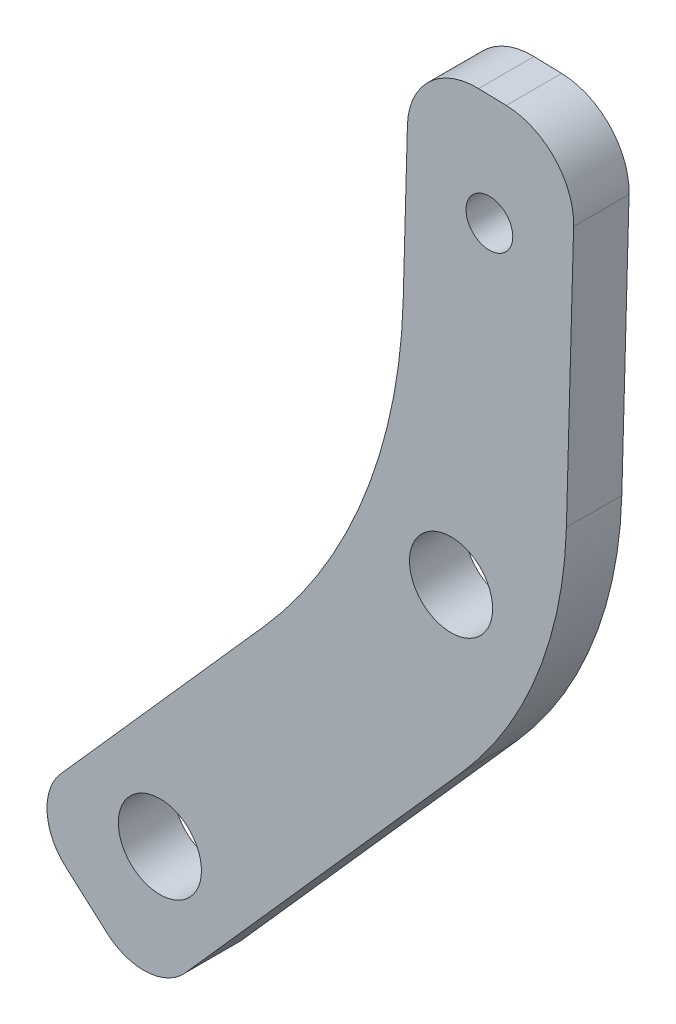
ISO-10303-21;
HEADER;
FILE_DESCRIPTION(('STEP AP214'),'2;1');
FILE_NAME('part.step','',(''),(''),'','','');
FILE_SCHEMA(('AUTOMOTIVE_DESIGN { 1 0 10303 214 1 1 1 1 }'));
ENDSEC;
DATA;
#1=APPLICATION_CONTEXT('core data for automotive mechanical design processes');
#2=APPLICATION_PROTOCOL_DEFINITION('international standard','automotive_design',2000,#1);
#3=PRODUCT_CONTEXT('',#1,'mechanical');
#4=PRODUCT('Part','Part','',(#3));
#5=PRODUCT_RELATED_PRODUCT_CATEGORY('part','',(#4));
#6=PRODUCT_DEFINITION_FORMATION('','',#4);
#7=PRODUCT_DEFINITION_CONTEXT('part definition',#1,'design');
#8=PRODUCT_DEFINITION('design','',#6,#7);
#9=PRODUCT_DEFINITION_SHAPE('','',#8);
#10=(LENGTH_UNIT() NAMED_UNIT(*) SI_UNIT(.MILLI.,.METRE.));
#11=(NAMED_UNIT(*) PLANE_ANGLE_UNIT() SI_UNIT($,.RADIAN.));
#12=(NAMED_UNIT(*) SI_UNIT($,.STERADIAN.) SOLID_ANGLE_UNIT());
#13=UNCERTAINTY_MEASURE_WITH_UNIT(LENGTH_MEASURE(1.E-05),#10,'distance_accuracy_value','');
#14=(GEOMETRIC_REPRESENTATION_CONTEXT(3) GLOBAL_UNCERTAINTY_ASSIGNED_CONTEXT((#13)) GLOBAL_UNIT_ASSIGNED_CONTEXT((#10,
#11,#12)) REPRESENTATION_CONTEXT('',''));
#15=CARTESIAN_POINT('',(0.,0.,0.));
#16=DIRECTION('',(0.,0.,1.));
#17=DIRECTION('',(1.,0.,0.));
#18=AXIS2_PLACEMENT_3D('',#15,#16,#17);
#19=CARTESIAN_POINT('',(0.,0.,4.));
#20=DIRECTION('',(0.,0.,1.));
#21=DIRECTION('',(1.,0.,0.));
#22=AXIS2_PLACEMENT_3D('',#19,#20,#21);
#23=PLANE('',#22);
#24=CARTESIAN_POINT('',(-0.123058618540551,6.90403287299958,4.));
#25=DIRECTION('',(0.,0.,1.));
#26=DIRECTION('',(1.,0.,0.));
#27=AXIS2_PLACEMENT_3D('',#24,#25,#26);
#28=CIRCLE('',#27,3.);
#29=CARTESIAN_POINT('',(2.87694138145945,6.90403287299958,4.));
#30=VERTEX_POINT('',#29);
#31=EDGE_CURVE('E416',#30,#30,#28,.T.);
#32=ORIENTED_EDGE('',*,*,#31,.F.);
#33=EDGE_LOOP('',(#32));
#34=FACE_BOUND('',#33,.T.);
#35=CARTESIAN_POINT('',(-21.1352453670654,-19.96983051424,4.));
#36=DIRECTION('',(0.,0.,1.));
#37=DIRECTION('',(1.,0.,0.));
#38=AXIS2_PLACEMENT_3D('',#35,#36,#37);
#39=CIRCLE('',#38,3.);
#40=CARTESIAN_POINT('',(-18.1352453670654,-19.96983051424,4.));
#41=VERTEX_POINT('',#40);
#42=EDGE_CURVE('E154',#41,#41,#39,.T.);
#43=ORIENTED_EDGE('',*,*,#42,.F.);
#44=EDGE_LOOP('',(#43));
#45=FACE_BOUND('',#44,.T.);
#46=DIRECTION('',(0.0273746411645566,0.999625244289635,0.));
#47=VECTOR('',#46,1.);
#48=CARTESIAN_POINT('',(7.9038481184229,3.73103549401107,4.));
#49=LINE('',#48,#47);
#50=CARTESIAN_POINT('',(8.20275475515141,14.6460505242862,4.));
#51=VERTEX_POINT('',#50);
#52=CARTESIAN_POINT('',(8.7250873533596,33.7197928227001,4.));
#53=VERTEX_POINT('',#52);
#54=EDGE_CURVE('E219',#51,#53,#49,.T.);
#55=ORIENTED_EDGE('',*,*,#54,.T.);
#56=CARTESIAN_POINT('',(3.72696113191143,33.8566660285229,4.));
#57=DIRECTION('',(0.,0.,1.));
#58=DIRECTION('',(1.,0.,0.));
#59=AXIS2_PLACEMENT_3D('',#56,#57,#58);
#60=CIRCLE('',#59,5.);
#61=CARTESIAN_POINT('',(3.86383433773419,38.854792249971,4.));
#62=VERTEX_POINT('',#61);
#63=EDGE_CURVE('E42',#53,#62,#60,.T.);
#64=ORIENTED_EDGE('',*,*,#63,.T.);
#65=DIRECTION('',(-0.999625244289635,0.0273746411645533,0.));
#66=VECTOR('',#65,1.);
#67=CARTESIAN_POINT('',(8.86196055918238,38.7179190441483,4.));
#68=LINE('',#67,#66);
#69=CARTESIAN_POINT('',(1.86458384915495,38.9095415323002,4.));
#70=VERTEX_POINT('',#69);
#71=EDGE_CURVE('E218',#62,#70,#68,.T.);
#72=ORIENTED_EDGE('',*,*,#71,.T.);
#73=CARTESIAN_POINT('',(1.72771064333218,33.911415310852,4.));
#74=DIRECTION('',(0.,0.,1.));
#75=DIRECTION('',(1.,0.,0.));
#76=AXIS2_PLACEMENT_3D('',#73,#74,#75);
#77=CIRCLE('',#76,5.);
#78=CARTESIAN_POINT('',(-3.270415578116,34.0482885166748,4.));
#79=VERTEX_POINT('',#78);
#80=EDGE_CURVE('E49',#70,#79,#77,.T.);
#81=ORIENTED_EDGE('',*,*,#80,.T.);
#82=DIRECTION('',(-0.0273746411645527,-0.999625244289635,0.));
#83=VECTOR('',#82,1.);
#84=CARTESIAN_POINT('',(-3.13354237229323,39.0464147381229,4.));
#85=LINE('',#84,#83);
#86=CARTESIAN_POINT('',(-3.57354997605657,22.9788905737962,4.));
#87=VERTEX_POINT('',#86);
#88=EDGE_CURVE('E225',#79,#87,#85,.T.);
#89=ORIENTED_EDGE('',*,*,#88,.T.);
#90=CARTESIAN_POINT('',(-43.558559747642,24.0738762203783,4.));
#91=DIRECTION('',(0.,0.,1.));
#92=DIRECTION('',(1.,0.,0.));
#93=AXIS2_PLACEMENT_3D('',#90,#91,#92);
#94=CIRCLE('',#93,40.);
#95=CARTESIAN_POINT('',(-13.6321084104685,-2.46680030385116,4.));
#96=VERTEX_POINT('',#95);
#97=EDGE_CURVE('E202',#87,#96,#94,.F.);
#98=ORIENTED_EDGE('',*,*,#97,.T.);
#99=DIRECTION('',(-0.663516913105737,-0.748161283429337,0.));
#100=VECTOR('',#99,1.);
#101=CARTESIAN_POINT('',(-3.97209215836119,8.42553720009595,4.));
#102=LINE('',#101,#100);
#103=CARTESIAN_POINT('',(-28.2782807200644,-18.9813741693229,4.));
#104=VERTEX_POINT('',#103);
#105=EDGE_CURVE('E163',#96,#104,#102,.T.);
#106=ORIENTED_EDGE('',*,*,#105,.T.);
#107=CARTESIAN_POINT('',(-25.285635586347,-21.6354418217459,4.));
#108=DIRECTION('',(0.,0.,1.));
#109=DIRECTION('',(1.,0.,0.));
#110=AXIS2_PLACEMENT_3D('',#107,#108,#109);
#111=CIRCLE('',#110,4.);
#112=CARTESIAN_POINT('',(-27.93970323877,-24.6280869554632,4.));
#113=VERTEX_POINT('',#112);
#114=EDGE_CURVE('E179',#104,#113,#111,.T.);
#115=ORIENTED_EDGE('',*,*,#114,.T.);
#116=DIRECTION('',(0.748161283429337,-0.663516913105738,0.));
#117=VECTOR('',#116,1.);
#118=CARTESIAN_POINT('',(-21.9544129713353,-29.9362222603091,4.));
#119=LINE('',#118,#117);
#120=CARTESIAN_POINT('',(-24.9470581050526,-27.2821546078862,4.));
#121=VERTEX_POINT('',#120);
#122=EDGE_CURVE('E146',#113,#121,#119,.T.);
#123=ORIENTED_EDGE('',*,*,#122,.T.);
#124=CARTESIAN_POINT('',(-22.2929904526297,-24.2895094741688,4.));
#125=DIRECTION('',(0.,0.,1.));
#126=DIRECTION('',(1.,0.,0.));
#127=AXIS2_PLACEMENT_3D('',#124,#125,#126);
#128=CIRCLE('',#127,4.);
#129=CARTESIAN_POINT('',(-19.3003453189123,-26.9435771265918,4.));
#130=VERTEX_POINT('',#129);
#131=EDGE_CURVE('E177',#121,#130,#128,.T.);
#132=ORIENTED_EDGE('',*,*,#131,.T.);
#133=DIRECTION('',(0.663516913105737,0.748161283429337,0.));
#134=VECTOR('',#133,1.);
#135=CARTESIAN_POINT('',(7.9038481184229,3.73103549401107,4.));
#136=LINE('',#135,#134);
#137=CARTESIAN_POINT('',(0.658835929342489,-4.43821763394921,4.));
#138=VERTEX_POINT('',#137);
#139=EDGE_CURVE('E240',#130,#138,#136,.T.);
#140=ORIENTED_EDGE('',*,*,#139,.T.);
#141=CARTESIAN_POINT('',(-21.7860025735376,15.4672897592229,4.));
#142=DIRECTION('',(0.,0.,1.));
#143=DIRECTION('',(1.,0.,0.));
#144=AXIS2_PLACEMENT_3D('',#141,#142,#143);
#145=CIRCLE('',#144,30.);
#146=EDGE_CURVE('E191',#138,#51,#145,.T.);
#147=ORIENTED_EDGE('',*,*,#146,.T.);
#148=EDGE_LOOP('',(#55,#64,#72,#81,#89,#98,#106,#115,#123,#132,#140,#147));
#149=FACE_BOUND('',#148,.T.);
#150=CARTESIAN_POINT('',(2.64521196412816,30.8851649368185,4.));
#151=DIRECTION('',(0.,0.,1.));
#152=DIRECTION('',(1.,0.,0.));
#153=AXIS2_PLACEMENT_3D('',#150,#151,#152);
#154=CIRCLE('',#153,1.68830796501838);
#155=CARTESIAN_POINT('',(4.33351992914653,30.8851649368185,4.));
#156=VERTEX_POINT('',#155);
#157=EDGE_CURVE('E408',#156,#156,#154,.T.);
#158=ORIENTED_EDGE('',*,*,#157,.F.);
#159=EDGE_LOOP('',(#158));
#160=FACE_BOUND('',#159,.T.);
#161=ADVANCED_FACE('F33',(#34,#45,#149,#160),#23,.T.);
#162=CARTESIAN_POINT('',(0.,0.,0.));
#163=DIRECTION('',(0.,0.,1.));
#164=DIRECTION('',(1.,0.,0.));
#165=AXIS2_PLACEMENT_3D('',#162,#163,#164);
#166=PLANE('',#165);
#167=CARTESIAN_POINT('',(-0.123058618540551,6.90403287299958,0.));
#168=DIRECTION('',(0.,0.,1.));
#169=DIRECTION('',(1.,0.,0.));
#170=AXIS2_PLACEMENT_3D('',#167,#168,#169);
#171=CIRCLE('',#170,3.);
#172=CARTESIAN_POINT('',(2.87694138145945,6.90403287299958,0.));
#173=VERTEX_POINT('',#172);
#174=EDGE_CURVE('E37',#173,#173,#171,.T.);
#175=ORIENTED_EDGE('',*,*,#174,.T.);
#176=EDGE_LOOP('',(#175));
#177=FACE_BOUND('',#176,.T.);
#178=DIRECTION('',(-0.999625244289635,0.0273746411645533,0.));
#179=VECTOR('',#178,1.);
#180=CARTESIAN_POINT('',(8.86196055918238,38.7179190441483,0.));
#181=LINE('',#180,#179);
#182=CARTESIAN_POINT('',(3.86383433773419,38.854792249971,0.));
#183=VERTEX_POINT('',#182);
#184=CARTESIAN_POINT('',(1.86458384915495,38.9095415323002,0.));
#185=VERTEX_POINT('',#184);
#186=EDGE_CURVE('E167',#183,#185,#181,.T.);
#187=ORIENTED_EDGE('',*,*,#186,.F.);
#188=CARTESIAN_POINT('',(3.72696113191143,33.8566660285229,0.));
#189=DIRECTION('',(0.,0.,1.));
#190=DIRECTION('',(1.,0.,0.));
#191=AXIS2_PLACEMENT_3D('',#188,#189,#190);
#192=CIRCLE('',#191,5.);
#193=CARTESIAN_POINT('',(8.7250873533596,33.7197928227001,0.));
#194=VERTEX_POINT('',#193);
#195=EDGE_CURVE('E211',#183,#194,#192,.F.);
#196=ORIENTED_EDGE('',*,*,#195,.T.);
#197=DIRECTION('',(0.0273746411645566,0.999625244289635,0.));
#198=VECTOR('',#197,1.);
#199=CARTESIAN_POINT('',(7.9038481184229,3.73103549401107,0.));
#200=LINE('',#199,#198);
#201=CARTESIAN_POINT('',(8.20275475515141,14.6460505242862,0.));
#202=VERTEX_POINT('',#201);
#203=EDGE_CURVE('E157',#202,#194,#200,.T.);
#204=ORIENTED_EDGE('',*,*,#203,.F.);
#205=CARTESIAN_POINT('',(-21.7860025735376,15.4672897592229,0.));
#206=DIRECTION('',(0.,0.,1.));
#207=DIRECTION('',(1.,0.,0.));
#208=AXIS2_PLACEMENT_3D('',#205,#206,#207);
#209=CIRCLE('',#208,30.);
#210=CARTESIAN_POINT('',(0.658835929342489,-4.43821763394921,0.));
#211=VERTEX_POINT('',#210);
#212=EDGE_CURVE('E187',#202,#211,#209,.F.);
#213=ORIENTED_EDGE('',*,*,#212,.T.);
#214=DIRECTION('',(0.663516913105737,0.748161283429337,0.));
#215=VECTOR('',#214,1.);
#216=CARTESIAN_POINT('',(7.9038481184229,3.73103549401107,0.));
#217=LINE('',#216,#215);
#218=CARTESIAN_POINT('',(-19.3003453189123,-26.9435771265918,0.));
#219=VERTEX_POINT('',#218);
#220=EDGE_CURVE('E153',#219,#211,#217,.T.);
#221=ORIENTED_EDGE('',*,*,#220,.F.);
#222=CARTESIAN_POINT('',(-22.2929904526297,-24.2895094741688,0.));
#223=DIRECTION('',(0.,0.,1.));
#224=DIRECTION('',(1.,0.,0.));
#225=AXIS2_PLACEMENT_3D('',#222,#223,#224);
#226=CIRCLE('',#225,4.);
#227=CARTESIAN_POINT('',(-24.9470581050526,-27.2821546078862,0.));
#228=VERTEX_POINT('',#227);
#229=EDGE_CURVE('E137',#219,#228,#226,.F.);
#230=ORIENTED_EDGE('',*,*,#229,.T.);
#231=DIRECTION('',(0.748161283429337,-0.663516913105738,0.));
#232=VECTOR('',#231,1.);
#233=CARTESIAN_POINT('',(-21.9544129713353,-29.9362222603091,0.));
#234=LINE('',#233,#232);
#235=CARTESIAN_POINT('',(-27.93970323877,-24.6280869554632,0.));
#236=VERTEX_POINT('',#235);
#237=EDGE_CURVE('E143',#236,#228,#234,.T.);
#238=ORIENTED_EDGE('',*,*,#237,.F.);
#239=CARTESIAN_POINT('',(-25.285635586347,-21.6354418217459,0.));
#240=DIRECTION('',(0.,0.,1.));
#241=DIRECTION('',(1.,0.,0.));
#242=AXIS2_PLACEMENT_3D('',#239,#240,#241);
#243=CIRCLE('',#242,4.);
#244=CARTESIAN_POINT('',(-28.2782807200644,-18.9813741693229,0.));
#245=VERTEX_POINT('',#244);
#246=EDGE_CURVE('E127',#236,#245,#243,.F.);
#247=ORIENTED_EDGE('',*,*,#246,.T.);
#248=DIRECTION('',(-0.663516913105737,-0.748161283429337,0.));
#249=VECTOR('',#248,1.);
#250=CARTESIAN_POINT('',(-3.97209215836119,8.42553720009595,0.));
#251=LINE('',#250,#249);
#252=CARTESIAN_POINT('',(-13.6321084104685,-2.46680030385116,0.));
#253=VERTEX_POINT('',#252);
#254=EDGE_CURVE('E172',#253,#245,#251,.T.);
#255=ORIENTED_EDGE('',*,*,#254,.F.);
#256=CARTESIAN_POINT('',(-43.558559747642,24.0738762203783,0.));
#257=DIRECTION('',(0.,0.,1.));
#258=DIRECTION('',(1.,0.,0.));
#259=AXIS2_PLACEMENT_3D('',#256,#257,#258);
#260=CIRCLE('',#259,40.);
#261=CARTESIAN_POINT('',(-3.57354997605657,22.9788905737962,0.));
#262=VERTEX_POINT('',#261);
#263=EDGE_CURVE('E199',#253,#262,#260,.T.);
#264=ORIENTED_EDGE('',*,*,#263,.T.);
#265=DIRECTION('',(-0.0273746411645527,-0.999625244289635,0.));
#266=VECTOR('',#265,1.);
#267=CARTESIAN_POINT('',(-3.13354237229323,39.0464147381229,0.));
#268=LINE('',#267,#266);
#269=CARTESIAN_POINT('',(-3.270415578116,34.0482885166748,0.));
#270=VERTEX_POINT('',#269);
#271=EDGE_CURVE('E170',#270,#262,#268,.T.);
#272=ORIENTED_EDGE('',*,*,#271,.F.);
#273=CARTESIAN_POINT('',(1.72771064333218,33.911415310852,0.));
#274=DIRECTION('',(0.,0.,1.));
#275=DIRECTION('',(1.,0.,0.));
#276=AXIS2_PLACEMENT_3D('',#273,#274,#275);
#277=CIRCLE('',#276,5.);
#278=EDGE_CURVE('E209',#270,#185,#277,.F.);
#279=ORIENTED_EDGE('',*,*,#278,.T.);
#280=EDGE_LOOP('',(#187,#196,#204,#213,#221,#230,#238,#247,#255,#264,#272,#279));
#281=FACE_BOUND('',#280,.T.);
#282=CARTESIAN_POINT('',(-21.1352453670654,-19.96983051424,0.));
#283=DIRECTION('',(0.,0.,1.));
#284=DIRECTION('',(1.,0.,0.));
#285=AXIS2_PLACEMENT_3D('',#282,#283,#284);
#286=CIRCLE('',#285,3.);
#287=CARTESIAN_POINT('',(-18.1352453670654,-19.96983051424,0.));
#288=VERTEX_POINT('',#287);
#289=EDGE_CURVE('E160',#288,#288,#286,.T.);
#290=ORIENTED_EDGE('',*,*,#289,.T.);
#291=EDGE_LOOP('',(#290));
#292=FACE_BOUND('',#291,.T.);
#293=CARTESIAN_POINT('',(2.64521196412816,30.8851649368185,0.));
#294=DIRECTION('',(0.,0.,1.));
#295=DIRECTION('',(1.,0.,0.));
#296=AXIS2_PLACEMENT_3D('',#293,#294,#295);
#297=CIRCLE('',#296,1.68830796501838);
#298=CARTESIAN_POINT('',(4.33351992914653,30.8851649368185,0.));
#299=VERTEX_POINT('',#298);
#300=EDGE_CURVE('E411',#299,#299,#297,.T.);
#301=ORIENTED_EDGE('',*,*,#300,.T.);
#302=EDGE_LOOP('',(#301));
#303=FACE_BOUND('',#302,.T.);
#304=ADVANCED_FACE('F150',(#177,#281,#292,#303),#166,.F.);
#305=CARTESIAN_POINT('',(-21.9544129713353,-29.9362222603091,4.));
#306=DIRECTION('',(0.663516913105738,0.748161283429337,0.));
#307=DIRECTION('',(-0.748161283429337,0.663516913105738,0.));
#308=AXIS2_PLACEMENT_3D('',#305,#306,#307);
#309=PLANE('',#308);
#310=ORIENTED_EDGE('',*,*,#122,.F.);
#311=DIRECTION('',(0.,0.,-1.));
#312=VECTOR('',#311,1.);
#313=CARTESIAN_POINT('',(-27.93970323877,-24.6280869554632,4.));
#314=LINE('',#313,#312);
#315=EDGE_CURVE('E131',#113,#236,#314,.T.);
#316=ORIENTED_EDGE('',*,*,#315,.T.);
#317=ORIENTED_EDGE('',*,*,#237,.T.);
#318=DIRECTION('',(0.,0.,-1.));
#319=VECTOR('',#318,1.);
#320=CARTESIAN_POINT('',(-24.9470581050526,-27.2821546078862,4.));
#321=LINE('',#320,#319);
#322=EDGE_CURVE('E147',#228,#121,#321,.F.);
#323=ORIENTED_EDGE('',*,*,#322,.T.);
#324=EDGE_LOOP('',(#310,#316,#317,#323));
#325=FACE_BOUND('',#324,.T.);
#326=ADVANCED_FACE('F142',(#325),#309,.F.);
#327=CARTESIAN_POINT('',(7.9038481184229,3.73103549401107,4.));
#328=DIRECTION('',(-0.748161283429337,0.663516913105738,0.));
#329=DIRECTION('',(-0.663516913105738,-0.748161283429337,0.));
#330=AXIS2_PLACEMENT_3D('',#327,#328,#329);
#331=PLANE('',#330);
#332=ORIENTED_EDGE('',*,*,#220,.T.);
#333=DIRECTION('',(0.,0.,-1.));
#334=VECTOR('',#333,1.);
#335=CARTESIAN_POINT('',(0.658835929342488,-4.43821763394921,4.));
#336=LINE('',#335,#334);
#337=EDGE_CURVE('E189',#211,#138,#336,.F.);
#338=ORIENTED_EDGE('',*,*,#337,.T.);
#339=ORIENTED_EDGE('',*,*,#139,.F.);
#340=DIRECTION('',(0.,0.,-1.));
#341=VECTOR('',#340,1.);
#342=CARTESIAN_POINT('',(-19.3003453189123,-26.9435771265918,4.));
#343=LINE('',#342,#341);
#344=EDGE_CURVE('E181',#130,#219,#343,.T.);
#345=ORIENTED_EDGE('',*,*,#344,.T.);
#346=EDGE_LOOP('',(#332,#338,#339,#345));
#347=FACE_BOUND('',#346,.T.);
#348=ADVANCED_FACE('F236',(#347),#331,.F.);
#349=CARTESIAN_POINT('',(7.9038481184229,3.73103549401107,4.));
#350=DIRECTION('',(-0.999625244289635,0.0273746411645566,0.));
#351=DIRECTION('',(-0.0273746411645566,-0.999625244289635,0.));
#352=AXIS2_PLACEMENT_3D('',#349,#350,#351);
#353=PLANE('',#352);
#354=ORIENTED_EDGE('',*,*,#203,.T.);
#355=DIRECTION('',(0.,0.,-1.));
#356=VECTOR('',#355,1.);
#357=CARTESIAN_POINT('',(8.7250873533596,33.7197928227001,4.));
#358=LINE('',#357,#356);
#359=EDGE_CURVE('E57',#194,#53,#358,.F.);
#360=ORIENTED_EDGE('',*,*,#359,.T.);
#361=ORIENTED_EDGE('',*,*,#54,.F.);
#362=DIRECTION('',(0.,0.,-1.));
#363=VECTOR('',#362,1.);
#364=CARTESIAN_POINT('',(8.20275475515141,14.6460505242862,4.));
#365=LINE('',#364,#363);
#366=EDGE_CURVE('E184',#51,#202,#365,.T.);
#367=ORIENTED_EDGE('',*,*,#366,.T.);
#368=EDGE_LOOP('',(#354,#360,#361,#367));
#369=FACE_BOUND('',#368,.T.);
#370=ADVANCED_FACE('F229',(#369),#353,.F.);
#371=CARTESIAN_POINT('',(8.86196055918238,38.7179190441483,4.));
#372=DIRECTION('',(-0.0273746411645533,-0.999625244289635,0.));
#373=DIRECTION('',(0.999625244289635,-0.0273746411645533,0.));
#374=AXIS2_PLACEMENT_3D('',#371,#372,#373);
#375=PLANE('',#374);
#376=ORIENTED_EDGE('',*,*,#71,.F.);
#377=DIRECTION('',(0.,0.,-1.));
#378=VECTOR('',#377,1.);
#379=CARTESIAN_POINT('',(3.86383433773419,38.854792249971,4.));
#380=LINE('',#379,#378);
#381=EDGE_CURVE('E206',#62,#183,#380,.T.);
#382=ORIENTED_EDGE('',*,*,#381,.T.);
#383=ORIENTED_EDGE('',*,*,#186,.T.);
#384=DIRECTION('',(0.,0.,-1.));
#385=VECTOR('',#384,1.);
#386=CARTESIAN_POINT('',(1.86458384915495,38.9095415323002,4.));
#387=LINE('',#386,#385);
#388=EDGE_CURVE('E204',#185,#70,#387,.F.);
#389=ORIENTED_EDGE('',*,*,#388,.T.);
#390=EDGE_LOOP('',(#376,#382,#383,#389));
#391=FACE_BOUND('',#390,.T.);
#392=ADVANCED_FACE('F223',(#391),#375,.F.);
#393=CARTESIAN_POINT('',(-3.13354237229323,39.0464147381229,4.));
#394=DIRECTION('',(0.999625244289635,-0.0273746411645527,0.));
#395=DIRECTION('',(0.0273746411645527,0.999625244289635,0.));
#396=AXIS2_PLACEMENT_3D('',#393,#394,#395);
#397=PLANE('',#396);
#398=ORIENTED_EDGE('',*,*,#88,.F.);
#399=DIRECTION('',(0.,0.,-1.));
#400=VECTOR('',#399,1.);
#401=CARTESIAN_POINT('',(-3.270415578116,34.0482885166748,4.));
#402=LINE('',#401,#400);
#403=EDGE_CURVE('E11',#79,#270,#402,.T.);
#404=ORIENTED_EDGE('',*,*,#403,.T.);
#405=ORIENTED_EDGE('',*,*,#271,.T.);
#406=DIRECTION('',(0.,0.,-1.));
#407=VECTOR('',#406,1.);
#408=CARTESIAN_POINT('',(-3.57354997605657,22.9788905737962,4.));
#409=LINE('',#408,#407);
#410=EDGE_CURVE('E196',#262,#87,#409,.F.);
#411=ORIENTED_EDGE('',*,*,#410,.T.);
#412=EDGE_LOOP('',(#398,#404,#405,#411));
#413=FACE_BOUND('',#412,.T.);
#414=ADVANCED_FACE('F258',(#413),#397,.F.);
#415=CARTESIAN_POINT('',(-3.97209215836119,8.42553720009595,4.));
#416=DIRECTION('',(0.748161283429337,-0.663516913105737,0.));
#417=DIRECTION('',(0.663516913105737,0.748161283429337,0.));
#418=AXIS2_PLACEMENT_3D('',#415,#416,#417);
#419=PLANE('',#418);
#420=ORIENTED_EDGE('',*,*,#105,.F.);
#421=DIRECTION('',(0.,0.,-1.));
#422=VECTOR('',#421,1.);
#423=CARTESIAN_POINT('',(-13.6321084104685,-2.46680030385116,0.));
#424=LINE('',#423,#422);
#425=EDGE_CURVE('E193',#96,#253,#424,.T.);
#426=ORIENTED_EDGE('',*,*,#425,.T.);
#427=ORIENTED_EDGE('',*,*,#254,.T.);
#428=DIRECTION('',(0.,0.,-1.));
#429=VECTOR('',#428,1.);
#430=CARTESIAN_POINT('',(-28.2782807200644,-18.9813741693229,4.));
#431=LINE('',#430,#429);
#432=EDGE_CURVE('E133',#245,#104,#431,.F.);
#433=ORIENTED_EDGE('',*,*,#432,.T.);
#434=EDGE_LOOP('',(#420,#426,#427,#433));
#435=FACE_BOUND('',#434,.T.);
#436=ADVANCED_FACE('F252',(#435),#419,.F.);
#437=CARTESIAN_POINT('',(-21.1352453670654,-19.96983051424,4.));
#438=DIRECTION('',(0.,0.,-1.));
#439=DIRECTION('',(-1.,0.,0.));
#440=AXIS2_PLACEMENT_3D('',#437,#438,#439);
#441=CYLINDRICAL_SURFACE('',#440,3.);
#442=ORIENTED_EDGE('',*,*,#42,.T.);
#443=EDGE_LOOP('',(#442));
#444=FACE_BOUND('',#443,.T.);
#445=ORIENTED_EDGE('',*,*,#289,.F.);
#446=EDGE_LOOP('',(#445));
#447=FACE_BOUND('',#446,.T.);
#448=ADVANCED_FACE('F280',(#444,#447),#441,.F.);
#449=CARTESIAN_POINT('',(2.64521196412816,30.8851649368185,4.));
#450=DIRECTION('',(0.,0.,-1.));
#451=DIRECTION('',(-1.,0.,0.));
#452=AXIS2_PLACEMENT_3D('',#449,#450,#451);
#453=CYLINDRICAL_SURFACE('',#452,1.68830796501838);
#454=ORIENTED_EDGE('',*,*,#157,.T.);
#455=EDGE_LOOP('',(#454));
#456=FACE_BOUND('',#455,.T.);
#457=ORIENTED_EDGE('',*,*,#300,.F.);
#458=EDGE_LOOP('',(#457));
#459=FACE_BOUND('',#458,.T.);
#460=ADVANCED_FACE('F297',(#456,#459),#453,.F.);
#461=CARTESIAN_POINT('',(-25.285635586347,-21.6354418217459,4.));
#462=DIRECTION('',(0.,0.,-1.));
#463=DIRECTION('',(-1.,0.,0.));
#464=AXIS2_PLACEMENT_3D('',#461,#462,#463);
#465=CYLINDRICAL_SURFACE('',#464,4.);
#466=ORIENTED_EDGE('',*,*,#114,.F.);
#467=ORIENTED_EDGE('',*,*,#432,.F.);
#468=ORIENTED_EDGE('',*,*,#246,.F.);
#469=ORIENTED_EDGE('',*,*,#315,.F.);
#470=EDGE_LOOP('',(#466,#467,#468,#469));
#471=FACE_BOUND('',#470,.T.);
#472=ADVANCED_FACE('F130',(#471),#465,.T.);
#473=CARTESIAN_POINT('',(-22.2929904526297,-24.2895094741688,4.));
#474=DIRECTION('',(0.,0.,-1.));
#475=DIRECTION('',(-1.,0.,0.));
#476=AXIS2_PLACEMENT_3D('',#473,#474,#475);
#477=CYLINDRICAL_SURFACE('',#476,4.);
#478=ORIENTED_EDGE('',*,*,#131,.F.);
#479=ORIENTED_EDGE('',*,*,#322,.F.);
#480=ORIENTED_EDGE('',*,*,#229,.F.);
#481=ORIENTED_EDGE('',*,*,#344,.F.);
#482=EDGE_LOOP('',(#478,#479,#480,#481));
#483=FACE_BOUND('',#482,.T.);
#484=ADVANCED_FACE('F243',(#483),#477,.T.);
#485=CARTESIAN_POINT('',(-21.7860025735376,15.4672897592229,4.));
#486=DIRECTION('',(0.,0.,-1.));
#487=DIRECTION('',(-1.,0.,0.));
#488=AXIS2_PLACEMENT_3D('',#485,#486,#487);
#489=CYLINDRICAL_SURFACE('',#488,30.);
#490=ORIENTED_EDGE('',*,*,#146,.F.);
#491=ORIENTED_EDGE('',*,*,#337,.F.);
#492=ORIENTED_EDGE('',*,*,#212,.F.);
#493=ORIENTED_EDGE('',*,*,#366,.F.);
#494=EDGE_LOOP('',(#490,#491,#492,#493));
#495=FACE_BOUND('',#494,.T.);
#496=ADVANCED_FACE('F233',(#495),#489,.T.);
#497=CARTESIAN_POINT('',(-43.558559747642,24.0738762203783,4.));
#498=DIRECTION('',(0.,0.,1.));
#499=DIRECTION('',(1.,0.,0.));
#500=AXIS2_PLACEMENT_3D('',#497,#498,#499);
#501=CYLINDRICAL_SURFACE('',#500,40.);
#502=ORIENTED_EDGE('',*,*,#97,.F.);
#503=ORIENTED_EDGE('',*,*,#410,.F.);
#504=ORIENTED_EDGE('',*,*,#263,.F.);
#505=ORIENTED_EDGE('',*,*,#425,.F.);
#506=EDGE_LOOP('',(#502,#503,#504,#505));
#507=FACE_BOUND('',#506,.T.);
#508=ADVANCED_FACE('F256',(#507),#501,.F.);
#509=CARTESIAN_POINT('',(3.72696113191143,33.8566660285229,4.));
#510=DIRECTION('',(0.,0.,-1.));
#511=DIRECTION('',(-1.,0.,0.));
#512=AXIS2_PLACEMENT_3D('',#509,#510,#511);
#513=CYLINDRICAL_SURFACE('',#512,5.);
#514=ORIENTED_EDGE('',*,*,#63,.F.);
#515=ORIENTED_EDGE('',*,*,#359,.F.);
#516=ORIENTED_EDGE('',*,*,#195,.F.);
#517=ORIENTED_EDGE('',*,*,#381,.F.);
#518=EDGE_LOOP('',(#514,#515,#516,#517));
#519=FACE_BOUND('',#518,.T.);
#520=ADVANCED_FACE('F227',(#519),#513,.T.);
#521=CARTESIAN_POINT('',(1.72771064333218,33.911415310852,4.));
#522=DIRECTION('',(0.,0.,-1.));
#523=DIRECTION('',(-1.,0.,0.));
#524=AXIS2_PLACEMENT_3D('',#521,#522,#523);
#525=CYLINDRICAL_SURFACE('',#524,5.);
#526=ORIENTED_EDGE('',*,*,#80,.F.);
#527=ORIENTED_EDGE('',*,*,#388,.F.);
#528=ORIENTED_EDGE('',*,*,#278,.F.);
#529=ORIENTED_EDGE('',*,*,#403,.F.);
#530=EDGE_LOOP('',(#526,#527,#528,#529));
#531=FACE_BOUND('',#530,.T.);
#532=ADVANCED_FACE('F35',(#531),#525,.T.);
#533=CARTESIAN_POINT('',(-0.123058618540551,6.90403287299958,-30.));
#534=DIRECTION('',(0.,0.,1.));
#535=DIRECTION('',(1.,0.,0.));
#536=AXIS2_PLACEMENT_3D('',#533,#534,#535);
#537=CYLINDRICAL_SURFACE('',#536,3.);
#538=ORIENTED_EDGE('',*,*,#31,.T.);
#539=EDGE_LOOP('',(#538));
#540=FACE_BOUND('',#539,.T.);
#541=ORIENTED_EDGE('',*,*,#174,.F.);
#542=EDGE_LOOP('',(#541));
#543=FACE_BOUND('',#542,.T.);
#544=ADVANCED_FACE('F262',(#540,#543),#537,.F.);
#545=CLOSED_SHELL('',(#161,#304,#326,#348,#370,#392,#414,#436,#448,#460,#472,#484,#496,#508,
#520,#532,#544));
#546=MANIFOLD_SOLID_BREP('B2',#545);
#547=ADVANCED_BREP_SHAPE_REPRESENTATION('',(#18,#546),#14);
#548=SHAPE_DEFINITION_REPRESENTATION(#9,#547);
ENDSEC;
END-ISO-10303-21;
